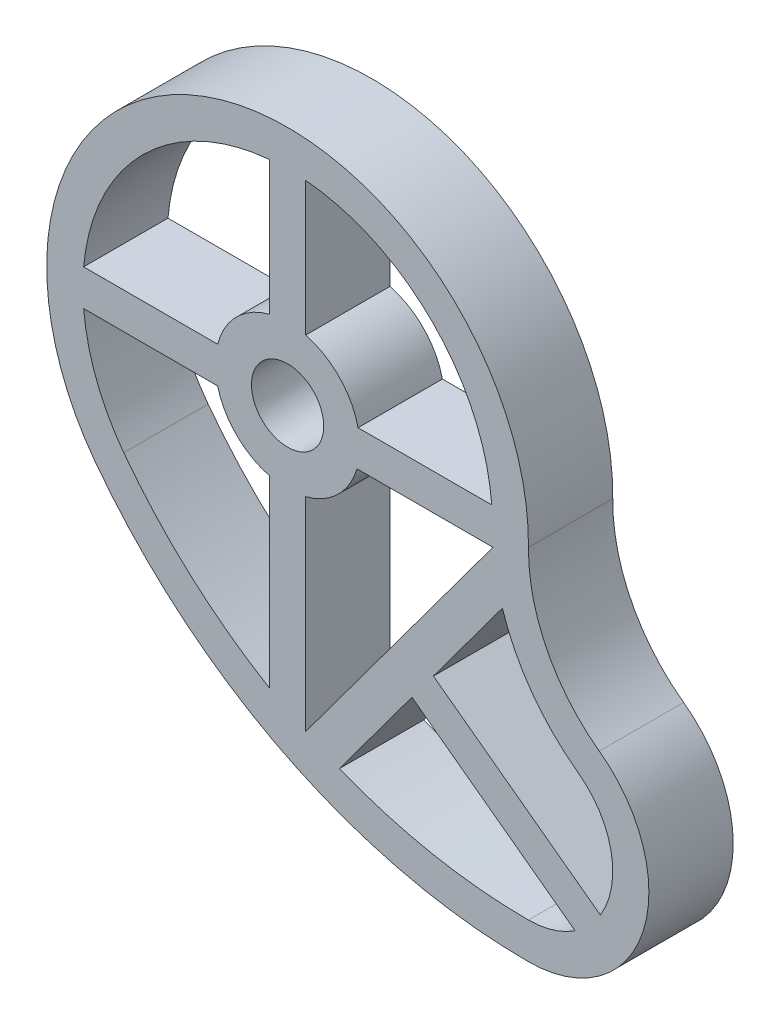
ISO-10303-21;
HEADER;
FILE_DESCRIPTION(('STEP AP214'),'2;1');
FILE_NAME('part.step','',(''),(''),'','','');
FILE_SCHEMA(('AUTOMOTIVE_DESIGN { 1 0 10303 214 1 1 1 1 }'));
ENDSEC;
DATA;
#1=APPLICATION_CONTEXT('core data for automotive mechanical design processes');
#2=APPLICATION_PROTOCOL_DEFINITION('international standard','automotive_design',2000,#1);
#3=PRODUCT_CONTEXT('',#1,'mechanical');
#4=PRODUCT('Part','Part','',(#3));
#5=PRODUCT_RELATED_PRODUCT_CATEGORY('part','',(#4));
#6=PRODUCT_DEFINITION_FORMATION('','',#4);
#7=PRODUCT_DEFINITION_CONTEXT('part definition',#1,'design');
#8=PRODUCT_DEFINITION('design','',#6,#7);
#9=PRODUCT_DEFINITION_SHAPE('','',#8);
#10=(LENGTH_UNIT() NAMED_UNIT(*) SI_UNIT(.MILLI.,.METRE.));
#11=(NAMED_UNIT(*) PLANE_ANGLE_UNIT() SI_UNIT($,.RADIAN.));
#12=(NAMED_UNIT(*) SI_UNIT($,.STERADIAN.) SOLID_ANGLE_UNIT());
#13=UNCERTAINTY_MEASURE_WITH_UNIT(LENGTH_MEASURE(1.E-05),#10,'distance_accuracy_value','');
#14=(GEOMETRIC_REPRESENTATION_CONTEXT(3) GLOBAL_UNCERTAINTY_ASSIGNED_CONTEXT((#13)) GLOBAL_UNIT_ASSIGNED_CONTEXT((#10,
#11,#12)) REPRESENTATION_CONTEXT('',''));
#15=CARTESIAN_POINT('',(0.,0.,0.));
#16=DIRECTION('',(0.,0.,1.));
#17=DIRECTION('',(1.,0.,0.));
#18=AXIS2_PLACEMENT_3D('',#15,#16,#17);
#19=CARTESIAN_POINT('',(0.,0.,7.));
#20=DIRECTION('',(0.,0.,1.));
#21=DIRECTION('',(1.,0.,0.));
#22=AXIS2_PLACEMENT_3D('',#19,#20,#21);
#23=PLANE('',#22);
#24=CARTESIAN_POINT('',(34.2959414156136,-0.352937281753556,7.));
#25=DIRECTION('',(0.,0.,1.));
#26=DIRECTION('',(1.,0.,0.));
#27=AXIS2_PLACEMENT_3D('',#24,#25,#26);
#28=CIRCLE('',#27,17.2977573947343);
#29=CARTESIAN_POINT('',(24.1185525183893,-14.3398299360117,7.));
#30=VERTEX_POINT('',#29);
#31=CARTESIAN_POINT('',(17.832718735599,-5.66092276358552,7.));
#32=VERTEX_POINT('',#31);
#33=EDGE_CURVE('E479',#30,#32,#28,.F.);
#34=ORIENTED_EDGE('',*,*,#33,.F.);
#35=CARTESIAN_POINT('',(20.,-20.,7.));
#36=DIRECTION('',(0.,0.,1.));
#37=DIRECTION('',(1.,0.,0.));
#38=AXIS2_PLACEMENT_3D('',#35,#36,#37);
#39=CIRCLE('',#38,6.99999999999998);
#40=CARTESIAN_POINT('',(25.9697396689758,-23.6554354439187,7.));
#41=VERTEX_POINT('',#40);
#42=EDGE_CURVE('E471',#30,#41,#39,.F.);
#43=ORIENTED_EDGE('',*,*,#42,.T.);
#44=DIRECTION('',(-0.804102988253617,0.594490020338108,0.));
#45=VECTOR('',#44,1.);
#46=CARTESIAN_POINT('',(-2.12985280130123,-2.8808238043973,7.));
#47=LINE('',#46,#45);
#48=CARTESIAN_POINT('',(12.106553003619,-13.4060939503144,7.));
#49=VERTEX_POINT('',#48);
#50=EDGE_CURVE('E474',#41,#49,#47,.T.);
#51=ORIENTED_EDGE('',*,*,#50,.T.);
#52=DIRECTION('',(-0.594490020338108,-0.804102988253617,0.));
#53=VECTOR('',#52,1.);
#54=CARTESIAN_POINT('',(14.2364058049202,-10.5252701459171,7.));
#55=LINE('',#54,#53);
#56=EDGE_CURVE('E477',#32,#49,#55,.T.);
#57=ORIENTED_EDGE('',*,*,#56,.F.);
#58=EDGE_LOOP('',(#34,#43,#51,#57));
#59=FACE_BOUND('',#58,.T.);
#60=CARTESIAN_POINT('',(0.,0.,7.));
#61=DIRECTION('',(0.,0.,1.));
#62=DIRECTION('',(1.,0.,0.));
#63=AXIS2_PLACEMENT_3D('',#60,#61,#62);
#64=CIRCLE('',#63,20.);
#65=CARTESIAN_POINT('',(19.9989410508099,-0.205807789524887,7.));
#66=VERTEX_POINT('',#65);
#67=CARTESIAN_POINT('',(-16.,-12.,7.));
#68=VERTEX_POINT('',#67);
#69=EDGE_CURVE('E505',#66,#68,#64,.T.);
#70=ORIENTED_EDGE('',*,*,#69,.T.);
#71=CARTESIAN_POINT('',(20.,14.9999999999999,7.));
#72=DIRECTION('',(0.,0.,1.));
#73=DIRECTION('',(1.,0.,0.));
#74=AXIS2_PLACEMENT_3D('',#71,#72,#73);
#75=CIRCLE('',#74,44.9999999999999);
#76=CARTESIAN_POINT('',(20.,-30.,7.));
#77=VERTEX_POINT('',#76);
#78=EDGE_CURVE('E509',#68,#77,#75,.T.);
#79=ORIENTED_EDGE('',*,*,#78,.T.);
#80=CARTESIAN_POINT('',(20.,-20.,7.));
#81=DIRECTION('',(0.,0.,1.));
#82=DIRECTION('',(1.,0.,0.));
#83=AXIS2_PLACEMENT_3D('',#80,#81,#82);
#84=CIRCLE('',#83,9.99999999999999);
#85=CARTESIAN_POINT('',(25.8836464548418,-11.914042765731,7.));
#86=VERTEX_POINT('',#85);
#87=EDGE_CURVE('E511',#77,#86,#84,.T.);
#88=ORIENTED_EDGE('',*,*,#87,.T.);
#89=CARTESIAN_POINT('',(34.2959414156136,-0.352937281753556,7.));
#90=DIRECTION('',(0.,0.,1.));
#91=DIRECTION('',(1.,0.,0.));
#92=AXIS2_PLACEMENT_3D('',#89,#90,#91);
#93=CIRCLE('',#92,14.2977573947343);
#94=EDGE_CURVE('E513',#66,#86,#93,.T.);
#95=ORIENTED_EDGE('',*,*,#94,.F.);
#96=EDGE_LOOP('',(#70,#79,#88,#95));
#97=FACE_BOUND('',#96,.T.);
#98=CARTESIAN_POINT('',(0.,0.,7.));
#99=DIRECTION('',(0.,0.,1.));
#100=DIRECTION('',(1.,0.,0.));
#101=AXIS2_PLACEMENT_3D('',#98,#99,#100);
#102=CIRCLE('',#101,3.);
#103=CARTESIAN_POINT('',(3.,0.,7.));
#104=VERTEX_POINT('',#103);
#105=EDGE_CURVE('E502',#104,#104,#102,.T.);
#106=ORIENTED_EDGE('',*,*,#105,.F.);
#107=EDGE_LOOP('',(#106));
#108=FACE_BOUND('',#107,.T.);
#109=CARTESIAN_POINT('',(0.,0.,7.));
#110=DIRECTION('',(0.,0.,1.));
#111=DIRECTION('',(1.,0.,0.));
#112=AXIS2_PLACEMENT_3D('',#109,#110,#111);
#113=CIRCLE('',#112,17.);
#114=CARTESIAN_POINT('',(-13.6,-10.2,7.));
#115=VERTEX_POINT('',#114);
#116=CARTESIAN_POINT('',(-16.9336942218761,-1.5,7.));
#117=VERTEX_POINT('',#116);
#118=EDGE_CURVE('E447',#115,#117,#113,.F.);
#119=ORIENTED_EDGE('',*,*,#118,.T.);
#120=DIRECTION('',(1.,0.,0.));
#121=VECTOR('',#120,1.);
#122=CARTESIAN_POINT('',(0.,-1.5,7.));
#123=LINE('',#122,#121);
#124=CARTESIAN_POINT('',(-5.80947501931113,-1.5,7.));
#125=VERTEX_POINT('',#124);
#126=EDGE_CURVE('E450',#117,#125,#123,.T.);
#127=ORIENTED_EDGE('',*,*,#126,.T.);
#128=CARTESIAN_POINT('',(0.,0.,7.));
#129=DIRECTION('',(0.,0.,1.));
#130=DIRECTION('',(1.,0.,0.));
#131=AXIS2_PLACEMENT_3D('',#128,#129,#130);
#132=CIRCLE('',#131,6.);
#133=CARTESIAN_POINT('',(-1.5,-5.80947501931113,7.));
#134=VERTEX_POINT('',#133);
#135=EDGE_CURVE('E439',#134,#125,#132,.F.);
#136=ORIENTED_EDGE('',*,*,#135,.F.);
#137=DIRECTION('',(0.,1.,0.));
#138=VECTOR('',#137,1.);
#139=CARTESIAN_POINT('',(-1.5,0.,7.));
#140=LINE('',#139,#138);
#141=CARTESIAN_POINT('',(-1.5,-21.0797727265569,7.));
#142=VERTEX_POINT('',#141);
#143=EDGE_CURVE('E441',#142,#134,#140,.T.);
#144=ORIENTED_EDGE('',*,*,#143,.F.);
#145=CARTESIAN_POINT('',(20.,14.9999999999999,7.));
#146=DIRECTION('',(0.,0.,1.));
#147=DIRECTION('',(1.,0.,0.));
#148=AXIS2_PLACEMENT_3D('',#145,#146,#147);
#149=CIRCLE('',#148,41.9999999999999);
#150=EDGE_CURVE('E444',#142,#115,#149,.F.);
#151=ORIENTED_EDGE('',*,*,#150,.T.);
#152=EDGE_LOOP('',(#119,#127,#136,#144,#151));
#153=FACE_BOUND('',#152,.T.);
#154=CARTESIAN_POINT('',(20.,-20.,7.));
#155=DIRECTION('',(0.,0.,1.));
#156=DIRECTION('',(1.,0.,0.));
#157=AXIS2_PLACEMENT_3D('',#154,#155,#156);
#158=CIRCLE('',#157,6.99999999999998);
#159=CARTESIAN_POINT('',(23.8692961048875,-25.8333993222394,7.));
#160=VERTEX_POINT('',#159);
#161=CARTESIAN_POINT('',(20.,-27.,7.));
#162=VERTEX_POINT('',#161);
#163=EDGE_CURVE('E458',#160,#162,#158,.F.);
#164=ORIENTED_EDGE('',*,*,#163,.T.);
#165=CARTESIAN_POINT('',(20.,14.9999999999999,7.));
#166=DIRECTION('',(0.,0.,1.));
#167=DIRECTION('',(1.,0.,0.));
#168=AXIS2_PLACEMENT_3D('',#165,#166,#167);
#169=CIRCLE('',#168,41.9999999999999);
#170=CARTESIAN_POINT('',(4.3056686433673,-23.9575148497465,7.));
#171=VERTEX_POINT('',#170);
#172=EDGE_CURVE('E308',#162,#171,#169,.F.);
#173=ORIENTED_EDGE('',*,*,#172,.T.);
#174=DIRECTION('',(-0.594490020338108,-0.804102988253617,0.));
#175=VECTOR('',#174,1.);
#176=CARTESIAN_POINT('',(14.2364058049202,-10.5252701459171,7.));
#177=LINE('',#176,#175);
#178=CARTESIAN_POINT('',(10.3230829426046,-15.8184029150753,7.));
#179=VERTEX_POINT('',#178);
#180=EDGE_CURVE('E453',#179,#171,#177,.T.);
#181=ORIENTED_EDGE('',*,*,#180,.F.);
#182=DIRECTION('',(-0.804102988253617,0.594490020338108,0.));
#183=VECTOR('',#182,1.);
#184=CARTESIAN_POINT('',(-3.91332286231555,-5.29313276915815,7.));
#185=LINE('',#184,#183);
#186=EDGE_CURVE('E455',#160,#179,#185,.T.);
#187=ORIENTED_EDGE('',*,*,#186,.F.);
#188=EDGE_LOOP('',(#164,#173,#181,#187));
#189=FACE_BOUND('',#188,.T.);
#190=CARTESIAN_POINT('',(0.,0.,7.));
#191=DIRECTION('',(0.,0.,1.));
#192=DIRECTION('',(1.,0.,0.));
#193=AXIS2_PLACEMENT_3D('',#190,#191,#192);
#194=CIRCLE('',#193,6.);
#195=CARTESIAN_POINT('',(5.76147440463906,-1.67493662109616,7.));
#196=VERTEX_POINT('',#195);
#197=CARTESIAN_POINT('',(1.5,-5.80947501931113,7.));
#198=VERTEX_POINT('',#197);
#199=EDGE_CURVE('E469',#196,#198,#194,.F.);
#200=ORIENTED_EDGE('',*,*,#199,.F.);
#201=DIRECTION('',(-1.,0.,0.));
#202=VECTOR('',#201,1.);
#203=CARTESIAN_POINT('',(0.,-1.67493662109616,7.));
#204=LINE('',#203,#202);
#205=CARTESIAN_POINT('',(17.0487756010844,-1.67493662109616,7.));
#206=VERTEX_POINT('',#205);
#207=EDGE_CURVE('E461',#206,#196,#204,.T.);
#208=ORIENTED_EDGE('',*,*,#207,.F.);
#209=DIRECTION('',(-0.594490020338108,-0.804102988253617,0.));
#210=VECTOR('',#209,1.);
#211=CARTESIAN_POINT('',(11.8240968401593,-8.74180008490283,7.));
#212=LINE('',#211,#210);
#213=CARTESIAN_POINT('',(1.5,-22.7061003022057,7.));
#214=VERTEX_POINT('',#213);
#215=EDGE_CURVE('E463',#206,#214,#212,.T.);
#216=ORIENTED_EDGE('',*,*,#215,.T.);
#217=DIRECTION('',(0.,1.,0.));
#218=VECTOR('',#217,1.);
#219=CARTESIAN_POINT('',(1.5,0.,7.));
#220=LINE('',#219,#218);
#221=EDGE_CURVE('E466',#214,#198,#220,.T.);
#222=ORIENTED_EDGE('',*,*,#221,.T.);
#223=EDGE_LOOP('',(#200,#208,#216,#222));
#224=FACE_BOUND('',#223,.T.);
#225=CARTESIAN_POINT('',(0.,0.,7.));
#226=DIRECTION('',(0.,0.,1.));
#227=DIRECTION('',(1.,0.,0.));
#228=AXIS2_PLACEMENT_3D('',#225,#226,#227);
#229=CIRCLE('',#228,17.);
#230=CARTESIAN_POINT('',(1.5,16.9336942218761,7.));
#231=VERTEX_POINT('',#230);
#232=CARTESIAN_POINT('',(16.9482803564812,1.32506337890384,7.));
#233=VERTEX_POINT('',#232);
#234=EDGE_CURVE('E486',#231,#233,#229,.F.);
#235=ORIENTED_EDGE('',*,*,#234,.T.);
#236=DIRECTION('',(-1.,0.,0.));
#237=VECTOR('',#236,1.);
#238=CARTESIAN_POINT('',(0.,1.32506337890384,7.));
#239=LINE('',#238,#237);
#240=CARTESIAN_POINT('',(5.85185500861803,1.32506337890384,7.));
#241=VERTEX_POINT('',#240);
#242=EDGE_CURVE('E489',#233,#241,#239,.T.);
#243=ORIENTED_EDGE('',*,*,#242,.T.);
#244=CARTESIAN_POINT('',(0.,0.,7.));
#245=DIRECTION('',(0.,0.,1.));
#246=DIRECTION('',(1.,0.,0.));
#247=AXIS2_PLACEMENT_3D('',#244,#245,#246);
#248=CIRCLE('',#247,6.);
#249=CARTESIAN_POINT('',(1.5,5.80947501931113,7.));
#250=VERTEX_POINT('',#249);
#251=EDGE_CURVE('E481',#250,#241,#248,.F.);
#252=ORIENTED_EDGE('',*,*,#251,.F.);
#253=DIRECTION('',(0.,1.,0.));
#254=VECTOR('',#253,1.);
#255=CARTESIAN_POINT('',(1.5,0.,7.));
#256=LINE('',#255,#254);
#257=EDGE_CURVE('E483',#250,#231,#256,.T.);
#258=ORIENTED_EDGE('',*,*,#257,.T.);
#259=EDGE_LOOP('',(#235,#243,#252,#258));
#260=FACE_BOUND('',#259,.T.);
#261=DIRECTION('',(0.,1.,0.));
#262=VECTOR('',#261,1.);
#263=CARTESIAN_POINT('',(-1.5,0.,7.));
#264=LINE('',#263,#262);
#265=CARTESIAN_POINT('',(-1.5,5.80947501931113,7.));
#266=VERTEX_POINT('',#265);
#267=CARTESIAN_POINT('',(-1.5,16.9336942218761,7.));
#268=VERTEX_POINT('',#267);
#269=EDGE_CURVE('E499',#266,#268,#264,.T.);
#270=ORIENTED_EDGE('',*,*,#269,.F.);
#271=CARTESIAN_POINT('',(0.,0.,7.));
#272=DIRECTION('',(0.,0.,1.));
#273=DIRECTION('',(1.,0.,0.));
#274=AXIS2_PLACEMENT_3D('',#271,#272,#273);
#275=CIRCLE('',#274,6.);
#276=CARTESIAN_POINT('',(-5.80947501931113,1.5,7.));
#277=VERTEX_POINT('',#276);
#278=EDGE_CURVE('E492',#277,#266,#275,.F.);
#279=ORIENTED_EDGE('',*,*,#278,.F.);
#280=DIRECTION('',(1.,0.,0.));
#281=VECTOR('',#280,1.);
#282=CARTESIAN_POINT('',(0.,1.5,7.));
#283=LINE('',#282,#281);
#284=CARTESIAN_POINT('',(-16.9336942218761,1.5,7.));
#285=VERTEX_POINT('',#284);
#286=EDGE_CURVE('E494',#285,#277,#283,.T.);
#287=ORIENTED_EDGE('',*,*,#286,.F.);
#288=CARTESIAN_POINT('',(0.,0.,7.));
#289=DIRECTION('',(0.,0.,1.));
#290=DIRECTION('',(1.,0.,0.));
#291=AXIS2_PLACEMENT_3D('',#288,#289,#290);
#292=CIRCLE('',#291,17.);
#293=EDGE_CURVE('E496',#285,#268,#292,.F.);
#294=ORIENTED_EDGE('',*,*,#293,.T.);
#295=EDGE_LOOP('',(#270,#279,#287,#294));
#296=FACE_BOUND('',#295,.T.);
#297=ADVANCED_FACE('F110',(#59,#97,#108,#153,#189,#224,#260,#296),#23,.T.);
#298=CARTESIAN_POINT('',(0.,0.,0.));
#299=DIRECTION('',(0.,0.,1.));
#300=DIRECTION('',(1.,0.,0.));
#301=AXIS2_PLACEMENT_3D('',#298,#299,#300);
#302=PLANE('',#301);
#303=DIRECTION('',(1.,0.,0.));
#304=VECTOR('',#303,1.);
#305=CARTESIAN_POINT('',(0.,1.32506337890384,0.));
#306=LINE('',#305,#304);
#307=CARTESIAN_POINT('',(5.85185500861803,1.32506337890384,0.));
#308=VERTEX_POINT('',#307);
#309=CARTESIAN_POINT('',(16.9482803564812,1.32506337890384,0.));
#310=VERTEX_POINT('',#309);
#311=EDGE_CURVE('E357',#308,#310,#306,.T.);
#312=ORIENTED_EDGE('',*,*,#311,.T.);
#313=CARTESIAN_POINT('',(0.,0.,0.));
#314=DIRECTION('',(0.,0.,1.));
#315=DIRECTION('',(1.,0.,0.));
#316=AXIS2_PLACEMENT_3D('',#313,#314,#315);
#317=CIRCLE('',#316,17.);
#318=CARTESIAN_POINT('',(1.5,16.9336942218761,0.));
#319=VERTEX_POINT('',#318);
#320=EDGE_CURVE('E360',#310,#319,#317,.T.);
#321=ORIENTED_EDGE('',*,*,#320,.T.);
#322=DIRECTION('',(0.,-1.,0.));
#323=VECTOR('',#322,1.);
#324=CARTESIAN_POINT('',(1.5,0.,0.));
#325=LINE('',#324,#323);
#326=CARTESIAN_POINT('',(1.5,5.80947501931113,0.));
#327=VERTEX_POINT('',#326);
#328=EDGE_CURVE('E364',#319,#327,#325,.T.);
#329=ORIENTED_EDGE('',*,*,#328,.T.);
#330=CARTESIAN_POINT('',(0.,0.,0.));
#331=DIRECTION('',(0.,0.,1.));
#332=DIRECTION('',(1.,0.,0.));
#333=AXIS2_PLACEMENT_3D('',#330,#331,#332);
#334=CIRCLE('',#333,6.);
#335=EDGE_CURVE('E367',#308,#327,#334,.T.);
#336=ORIENTED_EDGE('',*,*,#335,.F.);
#337=EDGE_LOOP('',(#312,#321,#329,#336));
#338=FACE_BOUND('',#337,.T.);
#339=CARTESIAN_POINT('',(20.,14.9999999999999,0.));
#340=DIRECTION('',(0.,0.,1.));
#341=DIRECTION('',(1.,0.,0.));
#342=AXIS2_PLACEMENT_3D('',#339,#340,#341);
#343=CIRCLE('',#342,41.9999999999999);
#344=CARTESIAN_POINT('',(4.3056686433673,-23.9575148497465,0.));
#345=VERTEX_POINT('',#344);
#346=CARTESIAN_POINT('',(20.,-27.,0.));
#347=VERTEX_POINT('',#346);
#348=EDGE_CURVE('E305',#345,#347,#343,.T.);
#349=ORIENTED_EDGE('',*,*,#348,.T.);
#350=CARTESIAN_POINT('',(20.,-20.,0.));
#351=DIRECTION('',(0.,0.,1.));
#352=DIRECTION('',(1.,0.,0.));
#353=AXIS2_PLACEMENT_3D('',#350,#351,#352);
#354=CIRCLE('',#353,6.99999999999998);
#355=CARTESIAN_POINT('',(23.8692961048875,-25.8333993222394,0.));
#356=VERTEX_POINT('',#355);
#357=EDGE_CURVE('E315',#347,#356,#354,.T.);
#358=ORIENTED_EDGE('',*,*,#357,.T.);
#359=DIRECTION('',(0.804102988253617,-0.594490020338108,0.));
#360=VECTOR('',#359,1.);
#361=CARTESIAN_POINT('',(-3.91332286231555,-5.29313276915815,0.));
#362=LINE('',#361,#360);
#363=CARTESIAN_POINT('',(10.3230829426046,-15.8184029150753,0.));
#364=VERTEX_POINT('',#363);
#365=EDGE_CURVE('E321',#364,#356,#362,.T.);
#366=ORIENTED_EDGE('',*,*,#365,.F.);
#367=DIRECTION('',(0.594490020338108,0.804102988253617,0.));
#368=VECTOR('',#367,1.);
#369=CARTESIAN_POINT('',(14.2364058049202,-10.5252701459171,0.));
#370=LINE('',#369,#368);
#371=EDGE_CURVE('E327',#345,#364,#370,.T.);
#372=ORIENTED_EDGE('',*,*,#371,.F.);
#373=EDGE_LOOP('',(#349,#358,#366,#372));
#374=FACE_BOUND('',#373,.T.);
#375=DIRECTION('',(-1.,0.,0.));
#376=VECTOR('',#375,1.);
#377=CARTESIAN_POINT('',(0.,-1.5,0.));
#378=LINE('',#377,#376);
#379=CARTESIAN_POINT('',(-5.80947501931113,-1.5,0.));
#380=VERTEX_POINT('',#379);
#381=CARTESIAN_POINT('',(-16.9336942218761,-1.5,0.));
#382=VERTEX_POINT('',#381);
#383=EDGE_CURVE('E356',#380,#382,#378,.T.);
#384=ORIENTED_EDGE('',*,*,#383,.T.);
#385=CARTESIAN_POINT('',(0.,0.,0.));
#386=DIRECTION('',(0.,0.,1.));
#387=DIRECTION('',(1.,0.,0.));
#388=AXIS2_PLACEMENT_3D('',#385,#386,#387);
#389=CIRCLE('',#388,17.);
#390=CARTESIAN_POINT('',(-13.6,-10.2,0.));
#391=VERTEX_POINT('',#390);
#392=EDGE_CURVE('E416',#382,#391,#389,.T.);
#393=ORIENTED_EDGE('',*,*,#392,.T.);
#394=CARTESIAN_POINT('',(20.,14.9999999999999,0.));
#395=DIRECTION('',(0.,0.,1.));
#396=DIRECTION('',(1.,0.,0.));
#397=AXIS2_PLACEMENT_3D('',#394,#395,#396);
#398=CIRCLE('',#397,41.9999999999999);
#399=CARTESIAN_POINT('',(-1.5,-21.0797727265569,0.));
#400=VERTEX_POINT('',#399);
#401=EDGE_CURVE('E419',#391,#400,#398,.T.);
#402=ORIENTED_EDGE('',*,*,#401,.T.);
#403=DIRECTION('',(0.,-1.,0.));
#404=VECTOR('',#403,1.);
#405=CARTESIAN_POINT('',(-1.5,0.,0.));
#406=LINE('',#405,#404);
#407=CARTESIAN_POINT('',(-1.5,-5.80947501931113,0.));
#408=VERTEX_POINT('',#407);
#409=EDGE_CURVE('E422',#408,#400,#406,.T.);
#410=ORIENTED_EDGE('',*,*,#409,.F.);
#411=CARTESIAN_POINT('',(0.,0.,0.));
#412=DIRECTION('',(0.,0.,1.));
#413=DIRECTION('',(1.,0.,0.));
#414=AXIS2_PLACEMENT_3D('',#411,#412,#413);
#415=CIRCLE('',#414,6.);
#416=EDGE_CURVE('E425',#380,#408,#415,.T.);
#417=ORIENTED_EDGE('',*,*,#416,.F.);
#418=EDGE_LOOP('',(#384,#393,#402,#410,#417));
#419=FACE_BOUND('',#418,.T.);
#420=CARTESIAN_POINT('',(0.,0.,0.));
#421=DIRECTION('',(0.,0.,1.));
#422=DIRECTION('',(1.,0.,0.));
#423=AXIS2_PLACEMENT_3D('',#420,#421,#422);
#424=CIRCLE('',#423,3.);
#425=CARTESIAN_POINT('',(3.,0.,0.));
#426=VERTEX_POINT('',#425);
#427=EDGE_CURVE('E501',#426,#426,#424,.T.);
#428=ORIENTED_EDGE('',*,*,#427,.T.);
#429=EDGE_LOOP('',(#428));
#430=FACE_BOUND('',#429,.T.);
#431=CARTESIAN_POINT('',(0.,0.,0.));
#432=DIRECTION('',(0.,0.,1.));
#433=DIRECTION('',(1.,0.,0.));
#434=AXIS2_PLACEMENT_3D('',#431,#432,#433);
#435=CIRCLE('',#434,20.);
#436=CARTESIAN_POINT('',(19.9989410508099,-0.205807789524887,0.));
#437=VERTEX_POINT('',#436);
#438=CARTESIAN_POINT('',(-16.,-12.,0.));
#439=VERTEX_POINT('',#438);
#440=EDGE_CURVE('E519',#437,#439,#435,.T.);
#441=ORIENTED_EDGE('',*,*,#440,.F.);
#442=CARTESIAN_POINT('',(34.2959414156136,-0.352937281753556,0.));
#443=DIRECTION('',(0.,0.,1.));
#444=DIRECTION('',(1.,0.,0.));
#445=AXIS2_PLACEMENT_3D('',#442,#443,#444);
#446=CIRCLE('',#445,14.2977573947343);
#447=CARTESIAN_POINT('',(25.8836464548418,-11.914042765731,0.));
#448=VERTEX_POINT('',#447);
#449=EDGE_CURVE('E506',#437,#448,#446,.T.);
#450=ORIENTED_EDGE('',*,*,#449,.T.);
#451=CARTESIAN_POINT('',(20.,-20.,0.));
#452=DIRECTION('',(0.,0.,1.));
#453=DIRECTION('',(1.,0.,0.));
#454=AXIS2_PLACEMENT_3D('',#451,#452,#453);
#455=CIRCLE('',#454,9.99999999999999);
#456=CARTESIAN_POINT('',(20.,-30.,0.));
#457=VERTEX_POINT('',#456);
#458=EDGE_CURVE('E524',#457,#448,#455,.T.);
#459=ORIENTED_EDGE('',*,*,#458,.F.);
#460=CARTESIAN_POINT('',(20.,14.9999999999999,0.));
#461=DIRECTION('',(0.,0.,1.));
#462=DIRECTION('',(1.,0.,0.));
#463=AXIS2_PLACEMENT_3D('',#460,#461,#462);
#464=CIRCLE('',#463,44.9999999999999);
#465=EDGE_CURVE('E522',#439,#457,#464,.T.);
#466=ORIENTED_EDGE('',*,*,#465,.F.);
#467=EDGE_LOOP('',(#441,#450,#459,#466));
#468=FACE_BOUND('',#467,.T.);
#469=DIRECTION('',(1.,0.,0.));
#470=VECTOR('',#469,1.);
#471=CARTESIAN_POINT('',(0.,-1.67493662109616,0.));
#472=LINE('',#471,#470);
#473=CARTESIAN_POINT('',(5.76147440463906,-1.67493662109616,0.));
#474=VERTEX_POINT('',#473);
#475=CARTESIAN_POINT('',(17.0487756010844,-1.67493662109616,0.));
#476=VERTEX_POINT('',#475);
#477=EDGE_CURVE('E403',#474,#476,#472,.T.);
#478=ORIENTED_EDGE('',*,*,#477,.F.);
#479=CARTESIAN_POINT('',(0.,0.,0.));
#480=DIRECTION('',(0.,0.,1.));
#481=DIRECTION('',(1.,0.,0.));
#482=AXIS2_PLACEMENT_3D('',#479,#480,#481);
#483=CIRCLE('',#482,6.);
#484=CARTESIAN_POINT('',(1.5,-5.80947501931113,0.));
#485=VERTEX_POINT('',#484);
#486=EDGE_CURVE('E395',#485,#474,#483,.T.);
#487=ORIENTED_EDGE('',*,*,#486,.F.);
#488=DIRECTION('',(0.,-1.,0.));
#489=VECTOR('',#488,1.);
#490=CARTESIAN_POINT('',(1.5,0.,0.));
#491=LINE('',#490,#489);
#492=CARTESIAN_POINT('',(1.5,-22.7061003022057,0.));
#493=VERTEX_POINT('',#492);
#494=EDGE_CURVE('E397',#485,#493,#491,.T.);
#495=ORIENTED_EDGE('',*,*,#494,.T.);
#496=DIRECTION('',(0.594490020338108,0.804102988253617,0.));
#497=VECTOR('',#496,1.);
#498=CARTESIAN_POINT('',(11.8240968401593,-8.74180008490283,0.));
#499=LINE('',#498,#497);
#500=EDGE_CURVE('E400',#493,#476,#499,.T.);
#501=ORIENTED_EDGE('',*,*,#500,.T.);
#502=EDGE_LOOP('',(#478,#487,#495,#501));
#503=FACE_BOUND('',#502,.T.);
#504=CARTESIAN_POINT('',(20.,-20.,0.));
#505=DIRECTION('',(0.,0.,1.));
#506=DIRECTION('',(1.,0.,0.));
#507=AXIS2_PLACEMENT_3D('',#504,#505,#506);
#508=CIRCLE('',#507,6.99999999999998);
#509=CARTESIAN_POINT('',(25.9697396689758,-23.6554354439187,0.));
#510=VERTEX_POINT('',#509);
#511=CARTESIAN_POINT('',(24.1185525183893,-14.3398299360117,0.));
#512=VERTEX_POINT('',#511);
#513=EDGE_CURVE('E383',#510,#512,#508,.T.);
#514=ORIENTED_EDGE('',*,*,#513,.T.);
#515=CARTESIAN_POINT('',(34.2959414156136,-0.352937281753556,0.));
#516=DIRECTION('',(0.,0.,1.));
#517=DIRECTION('',(1.,0.,0.));
#518=AXIS2_PLACEMENT_3D('',#515,#516,#517);
#519=CIRCLE('',#518,17.2977573947343);
#520=CARTESIAN_POINT('',(17.832718735599,-5.66092276358552,0.));
#521=VERTEX_POINT('',#520);
#522=EDGE_CURVE('E311',#521,#512,#519,.T.);
#523=ORIENTED_EDGE('',*,*,#522,.F.);
#524=DIRECTION('',(0.594490020338108,0.804102988253617,0.));
#525=VECTOR('',#524,1.);
#526=CARTESIAN_POINT('',(14.2364058049202,-10.5252701459171,0.));
#527=LINE('',#526,#525);
#528=CARTESIAN_POINT('',(12.106553003619,-13.4060939503144,0.));
#529=VERTEX_POINT('',#528);
#530=EDGE_CURVE('E377',#529,#521,#527,.T.);
#531=ORIENTED_EDGE('',*,*,#530,.F.);
#532=DIRECTION('',(0.804102988253617,-0.594490020338108,0.));
#533=VECTOR('',#532,1.);
#534=CARTESIAN_POINT('',(-2.12985280130123,-2.8808238043973,0.));
#535=LINE('',#534,#533);
#536=EDGE_CURVE('E380',#529,#510,#535,.T.);
#537=ORIENTED_EDGE('',*,*,#536,.T.);
#538=EDGE_LOOP('',(#514,#523,#531,#537));
#539=FACE_BOUND('',#538,.T.);
#540=CARTESIAN_POINT('',(0.,0.,0.));
#541=DIRECTION('',(0.,0.,1.));
#542=DIRECTION('',(1.,0.,0.));
#543=AXIS2_PLACEMENT_3D('',#540,#541,#542);
#544=CIRCLE('',#543,6.);
#545=CARTESIAN_POINT('',(-1.5,5.80947501931113,0.));
#546=VERTEX_POINT('',#545);
#547=CARTESIAN_POINT('',(-5.80947501931113,1.5,0.));
#548=VERTEX_POINT('',#547);
#549=EDGE_CURVE('E346',#546,#548,#544,.T.);
#550=ORIENTED_EDGE('',*,*,#549,.F.);
#551=DIRECTION('',(0.,-1.,0.));
#552=VECTOR('',#551,1.);
#553=CARTESIAN_POINT('',(-1.5,0.,0.));
#554=LINE('',#553,#552);
#555=CARTESIAN_POINT('',(-1.5,16.9336942218761,0.));
#556=VERTEX_POINT('',#555);
#557=EDGE_CURVE('E337',#556,#546,#554,.T.);
#558=ORIENTED_EDGE('',*,*,#557,.F.);
#559=CARTESIAN_POINT('',(0.,0.,0.));
#560=DIRECTION('',(0.,0.,1.));
#561=DIRECTION('',(1.,0.,0.));
#562=AXIS2_PLACEMENT_3D('',#559,#560,#561);
#563=CIRCLE('',#562,17.);
#564=CARTESIAN_POINT('',(-16.9336942218761,1.5,0.));
#565=VERTEX_POINT('',#564);
#566=EDGE_CURVE('E339',#556,#565,#563,.T.);
#567=ORIENTED_EDGE('',*,*,#566,.T.);
#568=DIRECTION('',(-1.,0.,0.));
#569=VECTOR('',#568,1.);
#570=CARTESIAN_POINT('',(0.,1.5,0.));
#571=LINE('',#570,#569);
#572=EDGE_CURVE('E343',#548,#565,#571,.T.);
#573=ORIENTED_EDGE('',*,*,#572,.F.);
#574=EDGE_LOOP('',(#550,#558,#567,#573));
#575=FACE_BOUND('',#574,.T.);
#576=ADVANCED_FACE('F324',(#338,#374,#419,#430,#468,#503,#539,#575),#302,.F.);
#577=CARTESIAN_POINT('',(0.,0.,7.));
#578=DIRECTION('',(0.,0.,-1.));
#579=DIRECTION('',(-1.,0.,0.));
#580=AXIS2_PLACEMENT_3D('',#577,#578,#579);
#581=CYLINDRICAL_SURFACE('',#580,20.);
#582=ORIENTED_EDGE('',*,*,#440,.T.);
#583=DIRECTION('',(0.,0.,-1.));
#584=VECTOR('',#583,1.);
#585=CARTESIAN_POINT('',(-16.,-12.,7.));
#586=LINE('',#585,#584);
#587=EDGE_CURVE('E12',#68,#439,#586,.T.);
#588=ORIENTED_EDGE('',*,*,#587,.F.);
#589=ORIENTED_EDGE('',*,*,#69,.F.);
#590=DIRECTION('',(0.,0.,-1.));
#591=VECTOR('',#590,1.);
#592=CARTESIAN_POINT('',(19.9989410508099,-0.205807789524887,7.));
#593=LINE('',#592,#591);
#594=EDGE_CURVE('E516',#66,#437,#593,.T.);
#595=ORIENTED_EDGE('',*,*,#594,.T.);
#596=EDGE_LOOP('',(#582,#588,#589,#595));
#597=FACE_BOUND('',#596,.T.);
#598=ADVANCED_FACE('F552',(#597),#581,.T.);
#599=CARTESIAN_POINT('',(20.,14.9999999999999,7.));
#600=DIRECTION('',(0.,0.,-1.));
#601=DIRECTION('',(-1.,0.,0.));
#602=AXIS2_PLACEMENT_3D('',#599,#600,#601);
#603=CYLINDRICAL_SURFACE('',#602,44.9999999999999);
#604=ORIENTED_EDGE('',*,*,#465,.T.);
#605=DIRECTION('',(0.,0.,-1.));
#606=VECTOR('',#605,1.);
#607=CARTESIAN_POINT('',(20.,-30.,7.));
#608=LINE('',#607,#606);
#609=EDGE_CURVE('E118',#77,#457,#608,.T.);
#610=ORIENTED_EDGE('',*,*,#609,.F.);
#611=ORIENTED_EDGE('',*,*,#78,.F.);
#612=ORIENTED_EDGE('',*,*,#587,.T.);
#613=EDGE_LOOP('',(#604,#610,#611,#612));
#614=FACE_BOUND('',#613,.T.);
#615=ADVANCED_FACE('F550',(#614),#603,.T.);
#616=CARTESIAN_POINT('',(20.,-20.,7.));
#617=DIRECTION('',(0.,0.,-1.));
#618=DIRECTION('',(-1.,0.,0.));
#619=AXIS2_PLACEMENT_3D('',#616,#617,#618);
#620=CYLINDRICAL_SURFACE('',#619,9.99999999999999);
#621=ORIENTED_EDGE('',*,*,#458,.T.);
#622=DIRECTION('',(0.,0.,-1.));
#623=VECTOR('',#622,1.);
#624=CARTESIAN_POINT('',(25.8836464548418,-11.914042765731,7.));
#625=LINE('',#624,#623);
#626=EDGE_CURVE('E530',#86,#448,#625,.T.);
#627=ORIENTED_EDGE('',*,*,#626,.F.);
#628=ORIENTED_EDGE('',*,*,#87,.F.);
#629=ORIENTED_EDGE('',*,*,#609,.T.);
#630=EDGE_LOOP('',(#621,#627,#628,#629));
#631=FACE_BOUND('',#630,.T.);
#632=ADVANCED_FACE('F536',(#631),#620,.T.);
#633=CARTESIAN_POINT('',(0.,0.,7.));
#634=DIRECTION('',(0.,0.,-1.));
#635=DIRECTION('',(-1.,0.,0.));
#636=AXIS2_PLACEMENT_3D('',#633,#634,#635);
#637=CYLINDRICAL_SURFACE('',#636,3.);
#638=ORIENTED_EDGE('',*,*,#105,.T.);
#639=EDGE_LOOP('',(#638));
#640=FACE_BOUND('',#639,.T.);
#641=ORIENTED_EDGE('',*,*,#427,.F.);
#642=EDGE_LOOP('',(#641));
#643=FACE_BOUND('',#642,.T.);
#644=ADVANCED_FACE('F112',(#640,#643),#637,.F.);
#645=CARTESIAN_POINT('',(34.2959414156136,-0.352937281753556,7.));
#646=DIRECTION('',(0.,0.,-1.));
#647=DIRECTION('',(-1.,0.,0.));
#648=AXIS2_PLACEMENT_3D('',#645,#646,#647);
#649=CYLINDRICAL_SURFACE('',#648,14.2977573947343);
#650=ORIENTED_EDGE('',*,*,#449,.F.);
#651=ORIENTED_EDGE('',*,*,#594,.F.);
#652=ORIENTED_EDGE('',*,*,#94,.T.);
#653=ORIENTED_EDGE('',*,*,#626,.T.);
#654=EDGE_LOOP('',(#650,#651,#652,#653));
#655=FACE_BOUND('',#654,.T.);
#656=ADVANCED_FACE('F544',(#655),#649,.F.);
#657=CARTESIAN_POINT('',(0.,-1.5,10.));
#658=DIRECTION('',(0.,-1.,0.));
#659=DIRECTION('',(1.,0.,0.));
#660=AXIS2_PLACEMENT_3D('',#657,#658,#659);
#661=PLANE('',#660);
#662=DIRECTION('',(0.,0.,-1.));
#663=VECTOR('',#662,1.);
#664=CARTESIAN_POINT('',(-16.9336942218761,-1.5,10.));
#665=LINE('',#664,#663);
#666=EDGE_CURVE('E437',#117,#382,#665,.T.);
#667=ORIENTED_EDGE('',*,*,#666,.T.);
#668=ORIENTED_EDGE('',*,*,#383,.F.);
#669=DIRECTION('',(0.,0.,-1.));
#670=VECTOR('',#669,1.);
#671=CARTESIAN_POINT('',(-5.80947501931113,-1.5,10.));
#672=LINE('',#671,#670);
#673=EDGE_CURVE('E428',#125,#380,#672,.T.);
#674=ORIENTED_EDGE('',*,*,#673,.F.);
#675=ORIENTED_EDGE('',*,*,#126,.F.);
#676=EDGE_LOOP('',(#667,#668,#674,#675));
#677=FACE_BOUND('',#676,.T.);
#678=ADVANCED_FACE('F568',(#677),#661,.T.);
#679=CARTESIAN_POINT('',(0.,0.,10.));
#680=DIRECTION('',(0.,0.,-1.));
#681=DIRECTION('',(-1.,0.,0.));
#682=AXIS2_PLACEMENT_3D('',#679,#680,#681);
#683=CYLINDRICAL_SURFACE('',#682,17.);
#684=DIRECTION('',(0.,0.,-1.));
#685=VECTOR('',#684,1.);
#686=CARTESIAN_POINT('',(-13.6,-10.2,10.));
#687=LINE('',#686,#685);
#688=EDGE_CURVE('E435',#115,#391,#687,.T.);
#689=ORIENTED_EDGE('',*,*,#688,.T.);
#690=ORIENTED_EDGE('',*,*,#392,.F.);
#691=ORIENTED_EDGE('',*,*,#666,.F.);
#692=ORIENTED_EDGE('',*,*,#118,.F.);
#693=EDGE_LOOP('',(#689,#690,#691,#692));
#694=FACE_BOUND('',#693,.T.);
#695=ADVANCED_FACE('F680',(#694),#683,.F.);
#696=CARTESIAN_POINT('',(20.,14.9999999999999,10.));
#697=DIRECTION('',(0.,0.,-1.));
#698=DIRECTION('',(-1.,0.,0.));
#699=AXIS2_PLACEMENT_3D('',#696,#697,#698);
#700=CYLINDRICAL_SURFACE('',#699,41.9999999999999);
#701=DIRECTION('',(0.,0.,-1.));
#702=VECTOR('',#701,1.);
#703=CARTESIAN_POINT('',(-1.5,-21.0797727265569,10.));
#704=LINE('',#703,#702);
#705=EDGE_CURVE('E433',#142,#400,#704,.T.);
#706=ORIENTED_EDGE('',*,*,#705,.T.);
#707=ORIENTED_EDGE('',*,*,#401,.F.);
#708=ORIENTED_EDGE('',*,*,#688,.F.);
#709=ORIENTED_EDGE('',*,*,#150,.F.);
#710=EDGE_LOOP('',(#706,#707,#708,#709));
#711=FACE_BOUND('',#710,.T.);
#712=ADVANCED_FACE('F677',(#711),#700,.F.);
#713=CARTESIAN_POINT('',(-1.5,0.,10.));
#714=DIRECTION('',(1.,0.,0.));
#715=DIRECTION('',(0.,1.,0.));
#716=AXIS2_PLACEMENT_3D('',#713,#714,#715);
#717=PLANE('',#716);
#718=ORIENTED_EDGE('',*,*,#143,.T.);
#719=DIRECTION('',(0.,0.,-1.));
#720=VECTOR('',#719,1.);
#721=CARTESIAN_POINT('',(-1.5,-5.80947501931113,10.));
#722=LINE('',#721,#720);
#723=EDGE_CURVE('E431',#134,#408,#722,.T.);
#724=ORIENTED_EDGE('',*,*,#723,.T.);
#725=ORIENTED_EDGE('',*,*,#409,.T.);
#726=ORIENTED_EDGE('',*,*,#705,.F.);
#727=EDGE_LOOP('',(#718,#724,#725,#726));
#728=FACE_BOUND('',#727,.T.);
#729=ADVANCED_FACE('F673',(#728),#717,.F.);
#730=CARTESIAN_POINT('',(0.,0.,10.));
#731=DIRECTION('',(0.,0.,-1.));
#732=DIRECTION('',(-1.,0.,0.));
#733=AXIS2_PLACEMENT_3D('',#730,#731,#732);
#734=CYLINDRICAL_SURFACE('',#733,6.);
#735=ORIENTED_EDGE('',*,*,#135,.T.);
#736=ORIENTED_EDGE('',*,*,#673,.T.);
#737=ORIENTED_EDGE('',*,*,#416,.T.);
#738=ORIENTED_EDGE('',*,*,#723,.F.);
#739=EDGE_LOOP('',(#735,#736,#737,#738));
#740=FACE_BOUND('',#739,.T.);
#741=ADVANCED_FACE('F670',(#740),#734,.T.);
#742=CARTESIAN_POINT('',(20.,14.9999999999999,10.));
#743=DIRECTION('',(0.,0.,-1.));
#744=DIRECTION('',(-1.,0.,0.));
#745=AXIS2_PLACEMENT_3D('',#742,#743,#744);
#746=CYLINDRICAL_SURFACE('',#745,41.9999999999999);
#747=DIRECTION('',(0.,0.,-1.));
#748=VECTOR('',#747,1.);
#749=CARTESIAN_POINT('',(20.,-27.,10.));
#750=LINE('',#749,#748);
#751=EDGE_CURVE('E300',#162,#347,#750,.T.);
#752=ORIENTED_EDGE('',*,*,#751,.T.);
#753=ORIENTED_EDGE('',*,*,#348,.F.);
#754=DIRECTION('',(0.,0.,-1.));
#755=VECTOR('',#754,1.);
#756=CARTESIAN_POINT('',(4.3056686433673,-23.9575148497465,10.));
#757=LINE('',#756,#755);
#758=EDGE_CURVE('E332',#171,#345,#757,.T.);
#759=ORIENTED_EDGE('',*,*,#758,.F.);
#760=ORIENTED_EDGE('',*,*,#172,.F.);
#761=EDGE_LOOP('',(#752,#753,#759,#760));
#762=FACE_BOUND('',#761,.T.);
#763=ADVANCED_FACE('F302',(#762),#746,.F.);
#764=CARTESIAN_POINT('',(20.,-20.,10.));
#765=DIRECTION('',(0.,0.,-1.));
#766=DIRECTION('',(-1.,0.,0.));
#767=AXIS2_PLACEMENT_3D('',#764,#765,#766);
#768=CYLINDRICAL_SURFACE('',#767,6.99999999999998);
#769=DIRECTION('',(0.,0.,-1.));
#770=VECTOR('',#769,1.);
#771=CARTESIAN_POINT('',(23.8692961048875,-25.8333993222394,10.));
#772=LINE('',#771,#770);
#773=EDGE_CURVE('E312',#160,#356,#772,.T.);
#774=ORIENTED_EDGE('',*,*,#773,.T.);
#775=ORIENTED_EDGE('',*,*,#357,.F.);
#776=ORIENTED_EDGE('',*,*,#751,.F.);
#777=ORIENTED_EDGE('',*,*,#163,.F.);
#778=EDGE_LOOP('',(#774,#775,#776,#777));
#779=FACE_BOUND('',#778,.T.);
#780=ADVANCED_FACE('F316',(#779),#768,.F.);
#781=CARTESIAN_POINT('',(-3.91332286231555,-5.29313276915815,10.));
#782=DIRECTION('',(0.594490020338108,0.804102988253617,0.));
#783=DIRECTION('',(-0.804102988253617,0.594490020338108,0.));
#784=AXIS2_PLACEMENT_3D('',#781,#782,#783);
#785=PLANE('',#784);
#786=ORIENTED_EDGE('',*,*,#186,.T.);
#787=DIRECTION('',(0.,0.,-1.));
#788=VECTOR('',#787,1.);
#789=CARTESIAN_POINT('',(10.3230829426046,-15.8184029150753,10.));
#790=LINE('',#789,#788);
#791=EDGE_CURVE('E334',#179,#364,#790,.T.);
#792=ORIENTED_EDGE('',*,*,#791,.T.);
#793=ORIENTED_EDGE('',*,*,#365,.T.);
#794=ORIENTED_EDGE('',*,*,#773,.F.);
#795=EDGE_LOOP('',(#786,#792,#793,#794));
#796=FACE_BOUND('',#795,.T.);
#797=ADVANCED_FACE('F753',(#796),#785,.F.);
#798=CARTESIAN_POINT('',(14.2364058049202,-10.5252701459171,10.));
#799=DIRECTION('',(-0.804102988253617,0.594490020338108,0.));
#800=DIRECTION('',(-0.594490020338108,-0.804102988253617,0.));
#801=AXIS2_PLACEMENT_3D('',#798,#799,#800);
#802=PLANE('',#801);
#803=ORIENTED_EDGE('',*,*,#180,.T.);
#804=ORIENTED_EDGE('',*,*,#758,.T.);
#805=ORIENTED_EDGE('',*,*,#371,.T.);
#806=ORIENTED_EDGE('',*,*,#791,.F.);
#807=EDGE_LOOP('',(#803,#804,#805,#806));
#808=FACE_BOUND('',#807,.T.);
#809=ADVANCED_FACE('F668',(#808),#802,.F.);
#810=CARTESIAN_POINT('',(0.,0.,10.));
#811=DIRECTION('',(0.,0.,-1.));
#812=DIRECTION('',(-1.,0.,0.));
#813=AXIS2_PLACEMENT_3D('',#810,#811,#812);
#814=CYLINDRICAL_SURFACE('',#813,6.);
#815=ORIENTED_EDGE('',*,*,#199,.T.);
#816=DIRECTION('',(0.,0.,-1.));
#817=VECTOR('',#816,1.);
#818=CARTESIAN_POINT('',(1.5,-5.80947501931113,10.));
#819=LINE('',#818,#817);
#820=EDGE_CURVE('E361',#198,#485,#819,.T.);
#821=ORIENTED_EDGE('',*,*,#820,.T.);
#822=ORIENTED_EDGE('',*,*,#486,.T.);
#823=DIRECTION('',(0.,0.,-1.));
#824=VECTOR('',#823,1.);
#825=CARTESIAN_POINT('',(5.76147440463906,-1.67493662109616,10.));
#826=LINE('',#825,#824);
#827=EDGE_CURVE('E406',#196,#474,#826,.T.);
#828=ORIENTED_EDGE('',*,*,#827,.F.);
#829=EDGE_LOOP('',(#815,#821,#822,#828));
#830=FACE_BOUND('',#829,.T.);
#831=ADVANCED_FACE('F664',(#830),#814,.T.);
#832=CARTESIAN_POINT('',(1.5,0.,10.));
#833=DIRECTION('',(1.,0.,0.));
#834=DIRECTION('',(0.,0.,-1.));
#835=AXIS2_PLACEMENT_3D('',#832,#833,#834);
#836=PLANE('',#835);
#837=DIRECTION('',(0.,0.,-1.));
#838=VECTOR('',#837,1.);
#839=CARTESIAN_POINT('',(1.5,-22.7061003022057,10.));
#840=LINE('',#839,#838);
#841=EDGE_CURVE('E411',#214,#493,#840,.T.);
#842=ORIENTED_EDGE('',*,*,#841,.T.);
#843=ORIENTED_EDGE('',*,*,#494,.F.);
#844=ORIENTED_EDGE('',*,*,#820,.F.);
#845=ORIENTED_EDGE('',*,*,#221,.F.);
#846=EDGE_LOOP('',(#842,#843,#844,#845));
#847=FACE_BOUND('',#846,.T.);
#848=ADVANCED_FACE('F660',(#847),#836,.T.);
#849=CARTESIAN_POINT('',(11.8240968401593,-8.74180008490283,10.));
#850=DIRECTION('',(-0.804102988253617,0.594490020338108,0.));
#851=DIRECTION('',(-0.594490020338108,-0.804102988253617,0.));
#852=AXIS2_PLACEMENT_3D('',#849,#850,#851);
#853=PLANE('',#852);
#854=DIRECTION('',(0.,0.,-1.));
#855=VECTOR('',#854,1.);
#856=CARTESIAN_POINT('',(17.0487756010844,-1.67493662109616,10.));
#857=LINE('',#856,#855);
#858=EDGE_CURVE('E409',#206,#476,#857,.T.);
#859=ORIENTED_EDGE('',*,*,#858,.T.);
#860=ORIENTED_EDGE('',*,*,#500,.F.);
#861=ORIENTED_EDGE('',*,*,#841,.F.);
#862=ORIENTED_EDGE('',*,*,#215,.F.);
#863=EDGE_LOOP('',(#859,#860,#861,#862));
#864=FACE_BOUND('',#863,.T.);
#865=ADVANCED_FACE('F656',(#864),#853,.T.);
#866=CARTESIAN_POINT('',(0.,-1.67493662109616,10.));
#867=DIRECTION('',(0.,1.,0.));
#868=DIRECTION('',(0.,0.,1.));
#869=AXIS2_PLACEMENT_3D('',#866,#867,#868);
#870=PLANE('',#869);
#871=ORIENTED_EDGE('',*,*,#207,.T.);
#872=ORIENTED_EDGE('',*,*,#827,.T.);
#873=ORIENTED_EDGE('',*,*,#477,.T.);
#874=ORIENTED_EDGE('',*,*,#858,.F.);
#875=EDGE_LOOP('',(#871,#872,#873,#874));
#876=FACE_BOUND('',#875,.T.);
#877=ADVANCED_FACE('F652',(#876),#870,.F.);
#878=CARTESIAN_POINT('',(34.2959414156136,-0.352937281753556,10.));
#879=DIRECTION('',(0.,0.,-1.));
#880=DIRECTION('',(-1.,0.,0.));
#881=AXIS2_PLACEMENT_3D('',#878,#879,#880);
#882=CYLINDRICAL_SURFACE('',#881,17.2977573947343);
#883=ORIENTED_EDGE('',*,*,#33,.T.);
#884=DIRECTION('',(0.,0.,-1.));
#885=VECTOR('',#884,1.);
#886=CARTESIAN_POINT('',(17.832718735599,-5.66092276358552,10.));
#887=LINE('',#886,#885);
#888=EDGE_CURVE('E393',#32,#521,#887,.T.);
#889=ORIENTED_EDGE('',*,*,#888,.T.);
#890=ORIENTED_EDGE('',*,*,#522,.T.);
#891=DIRECTION('',(0.,0.,-1.));
#892=VECTOR('',#891,1.);
#893=CARTESIAN_POINT('',(24.1185525183893,-14.3398299360117,10.));
#894=LINE('',#893,#892);
#895=EDGE_CURVE('E386',#30,#512,#894,.T.);
#896=ORIENTED_EDGE('',*,*,#895,.F.);
#897=EDGE_LOOP('',(#883,#889,#890,#896));
#898=FACE_BOUND('',#897,.T.);
#899=ADVANCED_FACE('F648',(#898),#882,.T.);
#900=CARTESIAN_POINT('',(14.2364058049202,-10.5252701459171,10.));
#901=DIRECTION('',(-0.804102988253617,0.594490020338108,0.));
#902=DIRECTION('',(-0.594490020338108,-0.804102988253617,0.));
#903=AXIS2_PLACEMENT_3D('',#900,#901,#902);
#904=PLANE('',#903);
#905=ORIENTED_EDGE('',*,*,#56,.T.);
#906=DIRECTION('',(0.,0.,-1.));
#907=VECTOR('',#906,1.);
#908=CARTESIAN_POINT('',(12.106553003619,-13.4060939503144,10.));
#909=LINE('',#908,#907);
#910=EDGE_CURVE('E391',#49,#529,#909,.T.);
#911=ORIENTED_EDGE('',*,*,#910,.T.);
#912=ORIENTED_EDGE('',*,*,#530,.T.);
#913=ORIENTED_EDGE('',*,*,#888,.F.);
#914=EDGE_LOOP('',(#905,#911,#912,#913));
#915=FACE_BOUND('',#914,.T.);
#916=ADVANCED_FACE('F644',(#915),#904,.F.);
#917=CARTESIAN_POINT('',(-2.12985280130123,-2.8808238043973,10.));
#918=DIRECTION('',(0.594490020338108,0.804102988253617,0.));
#919=DIRECTION('',(-0.804102988253617,0.594490020338108,0.));
#920=AXIS2_PLACEMENT_3D('',#917,#918,#919);
#921=PLANE('',#920);
#922=DIRECTION('',(0.,0.,-1.));
#923=VECTOR('',#922,1.);
#924=CARTESIAN_POINT('',(25.9697396689758,-23.6554354439187,10.));
#925=LINE('',#924,#923);
#926=EDGE_CURVE('E389',#41,#510,#925,.T.);
#927=ORIENTED_EDGE('',*,*,#926,.T.);
#928=ORIENTED_EDGE('',*,*,#536,.F.);
#929=ORIENTED_EDGE('',*,*,#910,.F.);
#930=ORIENTED_EDGE('',*,*,#50,.F.);
#931=EDGE_LOOP('',(#927,#928,#929,#930));
#932=FACE_BOUND('',#931,.T.);
#933=ADVANCED_FACE('F640',(#932),#921,.T.);
#934=CARTESIAN_POINT('',(20.,-20.,10.));
#935=DIRECTION('',(0.,0.,-1.));
#936=DIRECTION('',(-1.,0.,0.));
#937=AXIS2_PLACEMENT_3D('',#934,#935,#936);
#938=CYLINDRICAL_SURFACE('',#937,6.99999999999998);
#939=ORIENTED_EDGE('',*,*,#895,.T.);
#940=ORIENTED_EDGE('',*,*,#513,.F.);
#941=ORIENTED_EDGE('',*,*,#926,.F.);
#942=ORIENTED_EDGE('',*,*,#42,.F.);
#943=EDGE_LOOP('',(#939,#940,#941,#942));
#944=FACE_BOUND('',#943,.T.);
#945=ADVANCED_FACE('F636',(#944),#938,.F.);
#946=CARTESIAN_POINT('',(0.,1.32506337890384,10.));
#947=DIRECTION('',(0.,1.,0.));
#948=DIRECTION('',(0.,0.,1.));
#949=AXIS2_PLACEMENT_3D('',#946,#947,#948);
#950=PLANE('',#949);
#951=DIRECTION('',(0.,0.,-1.));
#952=VECTOR('',#951,1.);
#953=CARTESIAN_POINT('',(16.9482803564812,1.32506337890384,10.));
#954=LINE('',#953,#952);
#955=EDGE_CURVE('E340',#233,#310,#954,.T.);
#956=ORIENTED_EDGE('',*,*,#955,.T.);
#957=ORIENTED_EDGE('',*,*,#311,.F.);
#958=DIRECTION('',(0.,0.,-1.));
#959=VECTOR('',#958,1.);
#960=CARTESIAN_POINT('',(5.85185500861803,1.32506337890384,10.));
#961=LINE('',#960,#959);
#962=EDGE_CURVE('E369',#241,#308,#961,.T.);
#963=ORIENTED_EDGE('',*,*,#962,.F.);
#964=ORIENTED_EDGE('',*,*,#242,.F.);
#965=EDGE_LOOP('',(#956,#957,#963,#964));
#966=FACE_BOUND('',#965,.T.);
#967=ADVANCED_FACE('F632',(#966),#950,.T.);
#968=CARTESIAN_POINT('',(0.,0.,10.));
#969=DIRECTION('',(0.,0.,-1.));
#970=DIRECTION('',(-1.,0.,0.));
#971=AXIS2_PLACEMENT_3D('',#968,#969,#970);
#972=CYLINDRICAL_SURFACE('',#971,17.);
#973=DIRECTION('',(0.,0.,-1.));
#974=VECTOR('',#973,1.);
#975=CARTESIAN_POINT('',(1.5,16.9336942218761,10.));
#976=LINE('',#975,#974);
#977=EDGE_CURVE('E373',#231,#319,#976,.T.);
#978=ORIENTED_EDGE('',*,*,#977,.T.);
#979=ORIENTED_EDGE('',*,*,#320,.F.);
#980=ORIENTED_EDGE('',*,*,#955,.F.);
#981=ORIENTED_EDGE('',*,*,#234,.F.);
#982=EDGE_LOOP('',(#978,#979,#980,#981));
#983=FACE_BOUND('',#982,.T.);
#984=ADVANCED_FACE('F628',(#983),#972,.F.);
#985=CARTESIAN_POINT('',(1.5,0.,10.));
#986=DIRECTION('',(1.,0.,0.));
#987=DIRECTION('',(0.,1.,0.));
#988=AXIS2_PLACEMENT_3D('',#985,#986,#987);
#989=PLANE('',#988);
#990=DIRECTION('',(0.,0.,-1.));
#991=VECTOR('',#990,1.);
#992=CARTESIAN_POINT('',(1.5,5.80947501931113,10.));
#993=LINE('',#992,#991);
#994=EDGE_CURVE('E133',#250,#327,#993,.T.);
#995=ORIENTED_EDGE('',*,*,#994,.T.);
#996=ORIENTED_EDGE('',*,*,#328,.F.);
#997=ORIENTED_EDGE('',*,*,#977,.F.);
#998=ORIENTED_EDGE('',*,*,#257,.F.);
#999=EDGE_LOOP('',(#995,#996,#997,#998));
#1000=FACE_BOUND('',#999,.T.);
#1001=ADVANCED_FACE('F625',(#1000),#989,.T.);
#1002=CARTESIAN_POINT('',(0.,0.,10.));
#1003=DIRECTION('',(0.,0.,-1.));
#1004=DIRECTION('',(-1.,0.,0.));
#1005=AXIS2_PLACEMENT_3D('',#1002,#1003,#1004);
#1006=CYLINDRICAL_SURFACE('',#1005,6.);
#1007=ORIENTED_EDGE('',*,*,#251,.T.);
#1008=ORIENTED_EDGE('',*,*,#962,.T.);
#1009=ORIENTED_EDGE('',*,*,#335,.T.);
#1010=ORIENTED_EDGE('',*,*,#994,.F.);
#1011=EDGE_LOOP('',(#1007,#1008,#1009,#1010));
#1012=FACE_BOUND('',#1011,.T.);
#1013=ADVANCED_FACE('F622',(#1012),#1006,.T.);
#1014=CARTESIAN_POINT('',(-1.5,0.,10.));
#1015=DIRECTION('',(1.,0.,0.));
#1016=DIRECTION('',(0.,1.,0.));
#1017=AXIS2_PLACEMENT_3D('',#1014,#1015,#1016);
#1018=PLANE('',#1017);
#1019=ORIENTED_EDGE('',*,*,#269,.T.);
#1020=DIRECTION('',(0.,0.,-1.));
#1021=VECTOR('',#1020,1.);
#1022=CARTESIAN_POINT('',(-1.5,16.9336942218761,10.));
#1023=LINE('',#1022,#1021);
#1024=EDGE_CURVE('E354',#268,#556,#1023,.T.);
#1025=ORIENTED_EDGE('',*,*,#1024,.T.);
#1026=ORIENTED_EDGE('',*,*,#557,.T.);
#1027=DIRECTION('',(0.,0.,-1.));
#1028=VECTOR('',#1027,1.);
#1029=CARTESIAN_POINT('',(-1.5,5.80947501931113,10.));
#1030=LINE('',#1029,#1028);
#1031=EDGE_CURVE('E348',#266,#546,#1030,.T.);
#1032=ORIENTED_EDGE('',*,*,#1031,.F.);
#1033=EDGE_LOOP('',(#1019,#1025,#1026,#1032));
#1034=FACE_BOUND('',#1033,.T.);
#1035=ADVANCED_FACE('F598',(#1034),#1018,.F.);
#1036=CARTESIAN_POINT('',(0.,0.,10.));
#1037=DIRECTION('',(0.,0.,-1.));
#1038=DIRECTION('',(-1.,0.,0.));
#1039=AXIS2_PLACEMENT_3D('',#1036,#1037,#1038);
#1040=CYLINDRICAL_SURFACE('',#1039,17.);
#1041=DIRECTION('',(0.,0.,-1.));
#1042=VECTOR('',#1041,1.);
#1043=CARTESIAN_POINT('',(-16.9336942218761,1.5,10.));
#1044=LINE('',#1043,#1042);
#1045=EDGE_CURVE('E352',#285,#565,#1044,.T.);
#1046=ORIENTED_EDGE('',*,*,#1045,.T.);
#1047=ORIENTED_EDGE('',*,*,#566,.F.);
#1048=ORIENTED_EDGE('',*,*,#1024,.F.);
#1049=ORIENTED_EDGE('',*,*,#293,.F.);
#1050=EDGE_LOOP('',(#1046,#1047,#1048,#1049));
#1051=FACE_BOUND('',#1050,.T.);
#1052=ADVANCED_FACE('F601',(#1051),#1040,.F.);
#1053=CARTESIAN_POINT('',(0.,1.5,10.));
#1054=DIRECTION('',(0.,-1.,0.));
#1055=DIRECTION('',(1.,0.,0.));
#1056=AXIS2_PLACEMENT_3D('',#1053,#1054,#1055);
#1057=PLANE('',#1056);
#1058=ORIENTED_EDGE('',*,*,#286,.T.);
#1059=DIRECTION('',(0.,0.,-1.));
#1060=VECTOR('',#1059,1.);
#1061=CARTESIAN_POINT('',(-5.80947501931113,1.5,10.));
#1062=LINE('',#1061,#1060);
#1063=EDGE_CURVE('E125',#277,#548,#1062,.T.);
#1064=ORIENTED_EDGE('',*,*,#1063,.T.);
#1065=ORIENTED_EDGE('',*,*,#572,.T.);
#1066=ORIENTED_EDGE('',*,*,#1045,.F.);
#1067=EDGE_LOOP('',(#1058,#1064,#1065,#1066));
#1068=FACE_BOUND('',#1067,.T.);
#1069=ADVANCED_FACE('F609',(#1068),#1057,.F.);
#1070=CARTESIAN_POINT('',(0.,0.,10.));
#1071=DIRECTION('',(0.,0.,-1.));
#1072=DIRECTION('',(-1.,0.,0.));
#1073=AXIS2_PLACEMENT_3D('',#1070,#1071,#1072);
#1074=CYLINDRICAL_SURFACE('',#1073,6.);
#1075=ORIENTED_EDGE('',*,*,#278,.T.);
#1076=ORIENTED_EDGE('',*,*,#1031,.T.);
#1077=ORIENTED_EDGE('',*,*,#549,.T.);
#1078=ORIENTED_EDGE('',*,*,#1063,.F.);
#1079=EDGE_LOOP('',(#1075,#1076,#1077,#1078));
#1080=FACE_BOUND('',#1079,.T.);
#1081=ADVANCED_FACE('F607',(#1080),#1074,.T.);
#1082=CLOSED_SHELL('',(#297,#576,#598,#615,#632,#644,#656,#678,#695,#712,#729,#741,#763,#780,
#797,#809,#831,#848,#865,#877,#899,#916,#933,#945,#967,#984,#1001,#1013,#1035,#1052,#1069,#1081));
#1083=MANIFOLD_SOLID_BREP('B2',#1082);
#1084=ADVANCED_BREP_SHAPE_REPRESENTATION('',(#18,#1083),#14);
#1085=SHAPE_DEFINITION_REPRESENTATION(#9,#1084);
ENDSEC;
END-ISO-10303-21;
